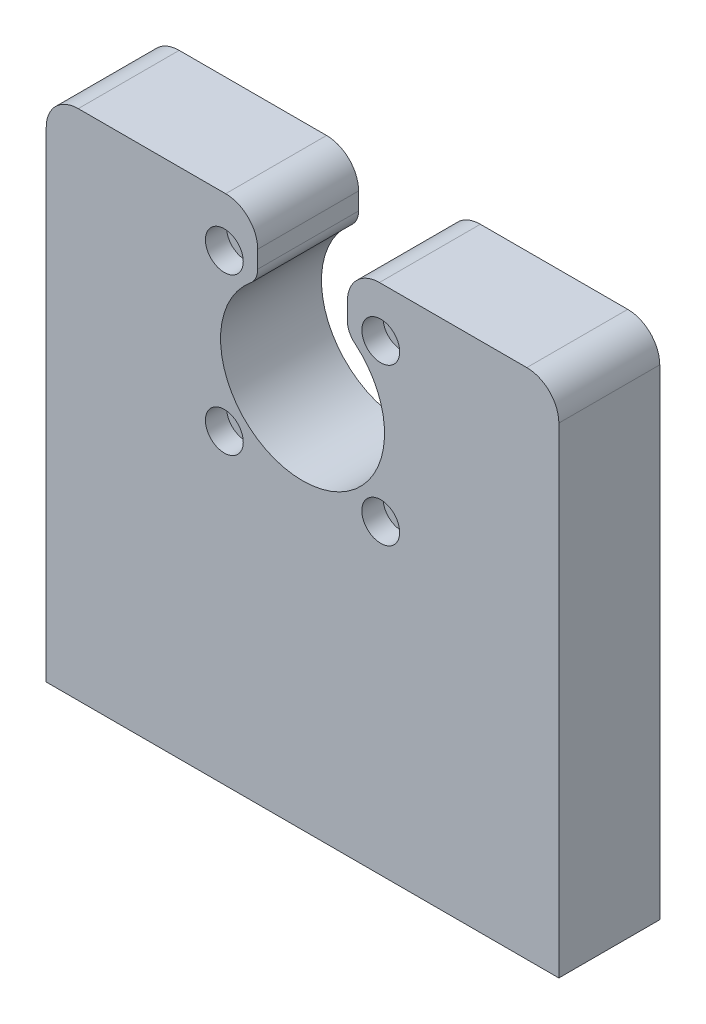
ISO-10303-21;
HEADER;
FILE_DESCRIPTION(('STEP AP214'),'2;1');
FILE_NAME('part.step','',(''),(''),'','','');
FILE_SCHEMA(('AUTOMOTIVE_DESIGN { 1 0 10303 214 1 1 1 1 }'));
ENDSEC;
DATA;
#1=APPLICATION_CONTEXT('core data for automotive mechanical design processes');
#2=APPLICATION_PROTOCOL_DEFINITION('international standard','automotive_design',2000,#1);
#3=PRODUCT_CONTEXT('',#1,'mechanical');
#4=PRODUCT('Part','Part','',(#3));
#5=PRODUCT_RELATED_PRODUCT_CATEGORY('part','',(#4));
#6=PRODUCT_DEFINITION_FORMATION('','',#4);
#7=PRODUCT_DEFINITION_CONTEXT('part definition',#1,'design');
#8=PRODUCT_DEFINITION('design','',#6,#7);
#9=PRODUCT_DEFINITION_SHAPE('','',#8);
#10=(LENGTH_UNIT() NAMED_UNIT(*) SI_UNIT(.MILLI.,.METRE.));
#11=(NAMED_UNIT(*) PLANE_ANGLE_UNIT() SI_UNIT($,.RADIAN.));
#12=(NAMED_UNIT(*) SI_UNIT($,.STERADIAN.) SOLID_ANGLE_UNIT());
#13=UNCERTAINTY_MEASURE_WITH_UNIT(LENGTH_MEASURE(1.E-05),#10,'distance_accuracy_value','');
#14=(GEOMETRIC_REPRESENTATION_CONTEXT(3) GLOBAL_UNCERTAINTY_ASSIGNED_CONTEXT((#13)) GLOBAL_UNIT_ASSIGNED_CONTEXT((#10,
#11,#12)) REPRESENTATION_CONTEXT('',''));
#15=CARTESIAN_POINT('',(0.,0.,0.));
#16=DIRECTION('',(0.,0.,1.));
#17=DIRECTION('',(1.,0.,0.));
#18=AXIS2_PLACEMENT_3D('',#15,#16,#17);
#19=CARTESIAN_POINT('',(-15.5,-15.5,-45.9619407771256));
#20=DIRECTION('',(0.,0.,1.));
#21=DIRECTION('',(1.,0.,0.));
#22=AXIS2_PLACEMENT_3D('',#19,#20,#21);
#23=CYLINDRICAL_SURFACE('',#22,2.15);
#24=CARTESIAN_POINT('',(-15.5,-15.5,0.));
#25=DIRECTION('',(0.,0.,-1.));
#26=DIRECTION('',(-1.,0.,0.));
#27=AXIS2_PLACEMENT_3D('',#24,#25,#26);
#28=CIRCLE('',#27,2.15);
#29=CARTESIAN_POINT('',(-17.65,-15.5,0.));
#30=VERTEX_POINT('',#29);
#31=EDGE_CURVE('E272',#30,#30,#28,.F.);
#32=ORIENTED_EDGE('',*,*,#31,.F.);
#33=EDGE_LOOP('',(#32));
#34=FACE_BOUND('',#33,.T.);
#35=CARTESIAN_POINT('',(-15.5,-15.5,15.8));
#36=DIRECTION('',(0.,0.,1.));
#37=DIRECTION('',(1.,0.,0.));
#38=AXIS2_PLACEMENT_3D('',#35,#36,#37);
#39=CIRCLE('',#38,2.15);
#40=CARTESIAN_POINT('',(-13.35,-15.5,15.8));
#41=VERTEX_POINT('',#40);
#42=EDGE_CURVE('E189',#41,#41,#39,.F.);
#43=ORIENTED_EDGE('',*,*,#42,.F.);
#44=EDGE_LOOP('',(#43));
#45=FACE_BOUND('',#44,.T.);
#46=ADVANCED_FACE('F44',(#34,#45),#23,.F.);
#47=CARTESIAN_POINT('',(-15.5,15.5,-45.9619407771256));
#48=DIRECTION('',(0.,0.,1.));
#49=DIRECTION('',(1.,0.,0.));
#50=AXIS2_PLACEMENT_3D('',#47,#48,#49);
#51=CYLINDRICAL_SURFACE('',#50,2.15);
#52=CARTESIAN_POINT('',(-15.5,15.5,0.));
#53=DIRECTION('',(0.,0.,-1.));
#54=DIRECTION('',(-1.,0.,0.));
#55=AXIS2_PLACEMENT_3D('',#52,#53,#54);
#56=CIRCLE('',#55,2.15);
#57=CARTESIAN_POINT('',(-17.65,15.5,0.));
#58=VERTEX_POINT('',#57);
#59=EDGE_CURVE('E288',#58,#58,#56,.F.);
#60=ORIENTED_EDGE('',*,*,#59,.F.);
#61=EDGE_LOOP('',(#60));
#62=FACE_BOUND('',#61,.T.);
#63=CARTESIAN_POINT('',(-15.5,15.5,15.8));
#64=DIRECTION('',(0.,0.,1.));
#65=DIRECTION('',(1.,0.,0.));
#66=AXIS2_PLACEMENT_3D('',#63,#64,#65);
#67=CIRCLE('',#66,2.15);
#68=CARTESIAN_POINT('',(-13.35,15.5,15.8));
#69=VERTEX_POINT('',#68);
#70=EDGE_CURVE('E186',#69,#69,#67,.F.);
#71=ORIENTED_EDGE('',*,*,#70,.F.);
#72=EDGE_LOOP('',(#71));
#73=FACE_BOUND('',#72,.T.);
#74=ADVANCED_FACE('F344',(#62,#73),#51,.F.);
#75=CARTESIAN_POINT('',(15.5,-15.5,-45.9619407771256));
#76=DIRECTION('',(0.,0.,1.));
#77=DIRECTION('',(1.,0.,0.));
#78=AXIS2_PLACEMENT_3D('',#75,#76,#77);
#79=CYLINDRICAL_SURFACE('',#78,2.15);
#80=CARTESIAN_POINT('',(15.5,-15.5,0.));
#81=DIRECTION('',(0.,0.,-1.));
#82=DIRECTION('',(-1.,0.,0.));
#83=AXIS2_PLACEMENT_3D('',#80,#81,#82);
#84=CIRCLE('',#83,2.15);
#85=CARTESIAN_POINT('',(13.35,-15.5,0.));
#86=VERTEX_POINT('',#85);
#87=EDGE_CURVE('E285',#86,#86,#84,.F.);
#88=ORIENTED_EDGE('',*,*,#87,.F.);
#89=EDGE_LOOP('',(#88));
#90=FACE_BOUND('',#89,.T.);
#91=CARTESIAN_POINT('',(15.5,-15.5,15.8));
#92=DIRECTION('',(0.,0.,1.));
#93=DIRECTION('',(1.,0.,0.));
#94=AXIS2_PLACEMENT_3D('',#91,#92,#93);
#95=CIRCLE('',#94,2.15);
#96=CARTESIAN_POINT('',(17.65,-15.5,15.8));
#97=VERTEX_POINT('',#96);
#98=EDGE_CURVE('E182',#97,#97,#95,.F.);
#99=ORIENTED_EDGE('',*,*,#98,.F.);
#100=EDGE_LOOP('',(#99));
#101=FACE_BOUND('',#100,.T.);
#102=ADVANCED_FACE('F350',(#90,#101),#79,.F.);
#103=CARTESIAN_POINT('',(15.5,15.5,-45.9619407771256));
#104=DIRECTION('',(0.,0.,1.));
#105=DIRECTION('',(1.,0.,0.));
#106=AXIS2_PLACEMENT_3D('',#103,#104,#105);
#107=CYLINDRICAL_SURFACE('',#106,2.15);
#108=CARTESIAN_POINT('',(15.5,15.5,0.));
#109=DIRECTION('',(0.,0.,-1.));
#110=DIRECTION('',(-1.,0.,0.));
#111=AXIS2_PLACEMENT_3D('',#108,#109,#110);
#112=CIRCLE('',#111,2.15);
#113=CARTESIAN_POINT('',(13.35,15.5,0.));
#114=VERTEX_POINT('',#113);
#115=EDGE_CURVE('E192',#114,#114,#112,.F.);
#116=ORIENTED_EDGE('',*,*,#115,.F.);
#117=EDGE_LOOP('',(#116));
#118=FACE_BOUND('',#117,.T.);
#119=CARTESIAN_POINT('',(15.5,15.5,15.8));
#120=DIRECTION('',(0.,0.,1.));
#121=DIRECTION('',(1.,0.,0.));
#122=AXIS2_PLACEMENT_3D('',#119,#120,#121);
#123=CIRCLE('',#122,2.15);
#124=CARTESIAN_POINT('',(17.65,15.5,15.8));
#125=VERTEX_POINT('',#124);
#126=EDGE_CURVE('E179',#125,#125,#123,.F.);
#127=ORIENTED_EDGE('',*,*,#126,.F.);
#128=EDGE_LOOP('',(#127));
#129=FACE_BOUND('',#128,.T.);
#130=ADVANCED_FACE('F358',(#118,#129),#107,.F.);
#131=CARTESIAN_POINT('',(-50.8,25.4,20.));
#132=DIRECTION('',(1.,0.,0.));
#133=DIRECTION('',(0.,1.,0.));
#134=AXIS2_PLACEMENT_3D('',#131,#132,#133);
#135=PLANE('',#134);
#136=DIRECTION('',(0.,-1.,0.));
#137=VECTOR('',#136,1.);
#138=CARTESIAN_POINT('',(-50.8,25.4,20.));
#139=LINE('',#138,#137);
#140=CARTESIAN_POINT('',(-50.8,19.05,20.));
#141=VERTEX_POINT('',#140);
#142=CARTESIAN_POINT('',(-50.8,-76.2,20.));
#143=VERTEX_POINT('',#142);
#144=EDGE_CURVE('E143',#141,#143,#139,.T.);
#145=ORIENTED_EDGE('',*,*,#144,.F.);
#146=DIRECTION('',(0.,0.,-1.));
#147=VECTOR('',#146,1.);
#148=CARTESIAN_POINT('',(-50.8,19.05,20.));
#149=LINE('',#148,#147);
#150=CARTESIAN_POINT('',(-50.8,19.05,0.));
#151=VERTEX_POINT('',#150);
#152=EDGE_CURVE('E211',#141,#151,#149,.T.);
#153=ORIENTED_EDGE('',*,*,#152,.T.);
#154=DIRECTION('',(0.,-1.,0.));
#155=VECTOR('',#154,1.);
#156=CARTESIAN_POINT('',(-50.8,25.4,0.));
#157=LINE('',#156,#155);
#158=CARTESIAN_POINT('',(-50.8,-76.2,0.));
#159=VERTEX_POINT('',#158);
#160=EDGE_CURVE('E168',#151,#159,#157,.T.);
#161=ORIENTED_EDGE('',*,*,#160,.T.);
#162=DIRECTION('',(0.,0.,-1.));
#163=VECTOR('',#162,1.);
#164=CARTESIAN_POINT('',(-50.8,-76.2,20.));
#165=LINE('',#164,#163);
#166=EDGE_CURVE('E160',#143,#159,#165,.T.);
#167=ORIENTED_EDGE('',*,*,#166,.F.);
#168=EDGE_LOOP('',(#145,#153,#161,#167));
#169=FACE_BOUND('',#168,.T.);
#170=ADVANCED_FACE('F166',(#169),#135,.F.);
#171=CARTESIAN_POINT('',(50.8,-76.2,20.));
#172=DIRECTION('',(0.,1.,0.));
#173=DIRECTION('',(-1.,0.,0.));
#174=AXIS2_PLACEMENT_3D('',#171,#172,#173);
#175=PLANE('',#174);
#176=DIRECTION('',(1.,0.,0.));
#177=VECTOR('',#176,1.);
#178=CARTESIAN_POINT('',(50.8,-76.2,0.));
#179=LINE('',#178,#177);
#180=CARTESIAN_POINT('',(50.8,-76.2,0.));
#181=VERTEX_POINT('',#180);
#182=EDGE_CURVE('E255',#159,#181,#179,.T.);
#183=ORIENTED_EDGE('',*,*,#182,.T.);
#184=DIRECTION('',(0.,0.,-1.));
#185=VECTOR('',#184,1.);
#186=CARTESIAN_POINT('',(50.8,-76.2,20.));
#187=LINE('',#186,#185);
#188=CARTESIAN_POINT('',(50.8,-76.2,20.));
#189=VERTEX_POINT('',#188);
#190=EDGE_CURVE('E162',#189,#181,#187,.T.);
#191=ORIENTED_EDGE('',*,*,#190,.F.);
#192=DIRECTION('',(1.,0.,0.));
#193=VECTOR('',#192,1.);
#194=CARTESIAN_POINT('',(50.8,-76.2,20.));
#195=LINE('',#194,#193);
#196=EDGE_CURVE('E147',#143,#189,#195,.T.);
#197=ORIENTED_EDGE('',*,*,#196,.F.);
#198=ORIENTED_EDGE('',*,*,#166,.T.);
#199=EDGE_LOOP('',(#183,#191,#197,#198));
#200=FACE_BOUND('',#199,.T.);
#201=ADVANCED_FACE('F159',(#200),#175,.F.);
#202=CARTESIAN_POINT('',(50.8,25.4,20.));
#203=DIRECTION('',(-1.,0.,0.));
#204=DIRECTION('',(0.,-1.,0.));
#205=AXIS2_PLACEMENT_3D('',#202,#203,#204);
#206=PLANE('',#205);
#207=DIRECTION('',(0.,1.,0.));
#208=VECTOR('',#207,1.);
#209=CARTESIAN_POINT('',(50.8,25.4,0.));
#210=LINE('',#209,#208);
#211=CARTESIAN_POINT('',(50.8,19.05,0.));
#212=VERTEX_POINT('',#211);
#213=EDGE_CURVE('E251',#181,#212,#210,.T.);
#214=ORIENTED_EDGE('',*,*,#213,.T.);
#215=DIRECTION('',(0.,0.,-1.));
#216=VECTOR('',#215,1.);
#217=CARTESIAN_POINT('',(50.8,19.05,20.));
#218=LINE('',#217,#216);
#219=CARTESIAN_POINT('',(50.8,19.05,20.));
#220=VERTEX_POINT('',#219);
#221=EDGE_CURVE('E11',#212,#220,#218,.F.);
#222=ORIENTED_EDGE('',*,*,#221,.T.);
#223=DIRECTION('',(0.,1.,0.));
#224=VECTOR('',#223,1.);
#225=CARTESIAN_POINT('',(50.8,25.4,20.));
#226=LINE('',#225,#224);
#227=EDGE_CURVE('E164',#189,#220,#226,.T.);
#228=ORIENTED_EDGE('',*,*,#227,.F.);
#229=ORIENTED_EDGE('',*,*,#190,.T.);
#230=EDGE_LOOP('',(#214,#222,#228,#229));
#231=FACE_BOUND('',#230,.T.);
#232=ADVANCED_FACE('F383',(#231),#206,.F.);
#233=CARTESIAN_POINT('',(50.8,25.4,20.));
#234=DIRECTION('',(0.,-1.,0.));
#235=DIRECTION('',(1.,0.,0.));
#236=AXIS2_PLACEMENT_3D('',#233,#234,#235);
#237=PLANE('',#236);
#238=DIRECTION('',(-1.,0.,0.));
#239=VECTOR('',#238,1.);
#240=CARTESIAN_POINT('',(50.8,25.4,0.));
#241=LINE('',#240,#239);
#242=CARTESIAN_POINT('',(44.45,25.4,0.));
#243=VERTEX_POINT('',#242);
#244=CARTESIAN_POINT('',(15.24,25.4,0.));
#245=VERTEX_POINT('',#244);
#246=EDGE_CURVE('E242',#243,#245,#241,.T.);
#247=ORIENTED_EDGE('',*,*,#246,.T.);
#248=DIRECTION('',(0.,0.,-1.));
#249=VECTOR('',#248,1.);
#250=CARTESIAN_POINT('',(15.24,25.4,20.));
#251=LINE('',#250,#249);
#252=CARTESIAN_POINT('',(15.24,25.4,20.));
#253=VERTEX_POINT('',#252);
#254=EDGE_CURVE('E52',#245,#253,#251,.F.);
#255=ORIENTED_EDGE('',*,*,#254,.T.);
#256=DIRECTION('',(-1.,0.,0.));
#257=VECTOR('',#256,1.);
#258=CARTESIAN_POINT('',(50.8,25.4,20.));
#259=LINE('',#258,#257);
#260=CARTESIAN_POINT('',(44.45,25.4,20.));
#261=VERTEX_POINT('',#260);
#262=EDGE_CURVE('E243',#261,#253,#259,.T.);
#263=ORIENTED_EDGE('',*,*,#262,.F.);
#264=DIRECTION('',(0.,0.,-1.));
#265=VECTOR('',#264,1.);
#266=CARTESIAN_POINT('',(44.45,25.4,20.));
#267=LINE('',#266,#265);
#268=EDGE_CURVE('E237',#261,#243,#267,.T.);
#269=ORIENTED_EDGE('',*,*,#268,.T.);
#270=EDGE_LOOP('',(#247,#255,#263,#269));
#271=FACE_BOUND('',#270,.T.);
#272=ADVANCED_FACE('F241',(#271),#237,.F.);
#273=CARTESIAN_POINT('',(8.89000000000001,25.4,20.));
#274=DIRECTION('',(1.,0.,0.));
#275=DIRECTION('',(0.,1.,0.));
#276=AXIS2_PLACEMENT_3D('',#273,#274,#275);
#277=PLANE('',#276);
#278=DIRECTION('',(0.,-1.,0.));
#279=VECTOR('',#278,1.);
#280=CARTESIAN_POINT('',(8.89000000000001,25.4,20.));
#281=LINE('',#280,#279);
#282=CARTESIAN_POINT('',(8.89000000000001,19.05,20.));
#283=VERTEX_POINT('',#282);
#284=CARTESIAN_POINT('',(8.89000000000001,15.6176310623603,20.));
#285=VERTEX_POINT('',#284);
#286=EDGE_CURVE('E279',#283,#285,#281,.T.);
#287=ORIENTED_EDGE('',*,*,#286,.F.);
#288=DIRECTION('',(0.,0.,-1.));
#289=VECTOR('',#288,1.);
#290=CARTESIAN_POINT('',(8.89000000000001,19.05,20.));
#291=LINE('',#290,#289);
#292=CARTESIAN_POINT('',(8.89000000000001,19.05,0.));
#293=VERTEX_POINT('',#292);
#294=EDGE_CURVE('E234',#283,#293,#291,.T.);
#295=ORIENTED_EDGE('',*,*,#294,.T.);
#296=DIRECTION('',(0.,-1.,0.));
#297=VECTOR('',#296,1.);
#298=CARTESIAN_POINT('',(8.89000000000001,25.4,0.));
#299=LINE('',#298,#297);
#300=CARTESIAN_POINT('',(8.89000000000001,15.6176310623603,0.));
#301=VERTEX_POINT('',#300);
#302=EDGE_CURVE('E250',#293,#301,#299,.T.);
#303=ORIENTED_EDGE('',*,*,#302,.T.);
#304=DIRECTION('',(0.,0.,1.));
#305=VECTOR('',#304,1.);
#306=CARTESIAN_POINT('',(8.89000000000001,15.6176310623603,20.));
#307=LINE('',#306,#305);
#308=EDGE_CURVE('E173',#301,#285,#307,.T.);
#309=ORIENTED_EDGE('',*,*,#308,.T.);
#310=EDGE_LOOP('',(#287,#295,#303,#309));
#311=FACE_BOUND('',#310,.T.);
#312=ADVANCED_FACE('F376',(#311),#277,.F.);
#313=CARTESIAN_POINT('',(-8.88999999999999,25.4,20.));
#314=DIRECTION('',(-1.,0.,0.));
#315=DIRECTION('',(0.,-1.,0.));
#316=AXIS2_PLACEMENT_3D('',#313,#314,#315);
#317=PLANE('',#316);
#318=DIRECTION('',(0.,1.,0.));
#319=VECTOR('',#318,1.);
#320=CARTESIAN_POINT('',(-8.88999999999999,25.4,0.));
#321=LINE('',#320,#319);
#322=CARTESIAN_POINT('',(-8.88999999999999,15.6176310623603,0.));
#323=VERTEX_POINT('',#322);
#324=CARTESIAN_POINT('',(-8.88999999999999,19.05,0.));
#325=VERTEX_POINT('',#324);
#326=EDGE_CURVE('E253',#323,#325,#321,.T.);
#327=ORIENTED_EDGE('',*,*,#326,.T.);
#328=DIRECTION('',(0.,0.,-1.));
#329=VECTOR('',#328,1.);
#330=CARTESIAN_POINT('',(-8.88999999999999,19.05,20.));
#331=LINE('',#330,#329);
#332=CARTESIAN_POINT('',(-8.88999999999999,19.05,20.));
#333=VERTEX_POINT('',#332);
#334=EDGE_CURVE('E232',#325,#333,#331,.F.);
#335=ORIENTED_EDGE('',*,*,#334,.T.);
#336=DIRECTION('',(0.,1.,0.));
#337=VECTOR('',#336,1.);
#338=CARTESIAN_POINT('',(-8.88999999999999,25.4,20.));
#339=LINE('',#338,#337);
#340=CARTESIAN_POINT('',(-8.88999999999999,15.6176310623603,20.));
#341=VERTEX_POINT('',#340);
#342=EDGE_CURVE('E276',#341,#333,#339,.T.);
#343=ORIENTED_EDGE('',*,*,#342,.F.);
#344=DIRECTION('',(0.,0.,1.));
#345=VECTOR('',#344,1.);
#346=CARTESIAN_POINT('',(-8.88999999999999,15.6176310623603,20.));
#347=LINE('',#346,#345);
#348=EDGE_CURVE('E208',#341,#323,#347,.F.);
#349=ORIENTED_EDGE('',*,*,#348,.T.);
#350=EDGE_LOOP('',(#327,#335,#343,#349));
#351=FACE_BOUND('',#350,.T.);
#352=ADVANCED_FACE('F373',(#351),#317,.F.);
#353=CARTESIAN_POINT('',(-8.88999999999999,25.4,20.));
#354=DIRECTION('',(0.,-1.,0.));
#355=DIRECTION('',(1.,0.,0.));
#356=AXIS2_PLACEMENT_3D('',#353,#354,#355);
#357=PLANE('',#356);
#358=DIRECTION('',(-1.,0.,0.));
#359=VECTOR('',#358,1.);
#360=CARTESIAN_POINT('',(-8.88999999999999,25.4,0.));
#361=LINE('',#360,#359);
#362=CARTESIAN_POINT('',(-15.24,25.4,0.));
#363=VERTEX_POINT('',#362);
#364=CARTESIAN_POINT('',(-44.45,25.4,0.));
#365=VERTEX_POINT('',#364);
#366=EDGE_CURVE('E155',#363,#365,#361,.T.);
#367=ORIENTED_EDGE('',*,*,#366,.T.);
#368=DIRECTION('',(0.,0.,-1.));
#369=VECTOR('',#368,1.);
#370=CARTESIAN_POINT('',(-44.45,25.4,20.));
#371=LINE('',#370,#369);
#372=CARTESIAN_POINT('',(-44.45,25.4,20.));
#373=VERTEX_POINT('',#372);
#374=EDGE_CURVE('E224',#365,#373,#371,.F.);
#375=ORIENTED_EDGE('',*,*,#374,.T.);
#376=DIRECTION('',(-1.,0.,0.));
#377=VECTOR('',#376,1.);
#378=CARTESIAN_POINT('',(-8.88999999999999,25.4,20.));
#379=LINE('',#378,#377);
#380=CARTESIAN_POINT('',(-15.24,25.4,20.));
#381=VERTEX_POINT('',#380);
#382=EDGE_CURVE('E175',#381,#373,#379,.T.);
#383=ORIENTED_EDGE('',*,*,#382,.F.);
#384=DIRECTION('',(0.,0.,-1.));
#385=VECTOR('',#384,1.);
#386=CARTESIAN_POINT('',(-15.24,25.4,20.));
#387=LINE('',#386,#385);
#388=EDGE_CURVE('E221',#381,#363,#387,.T.);
#389=ORIENTED_EDGE('',*,*,#388,.T.);
#390=EDGE_LOOP('',(#367,#375,#383,#389));
#391=FACE_BOUND('',#390,.T.);
#392=ADVANCED_FACE('F264',(#391),#357,.F.);
#393=CARTESIAN_POINT('',(0.,0.,20.));
#394=DIRECTION('',(0.,0.,-1.));
#395=DIRECTION('',(-1.,0.,0.));
#396=AXIS2_PLACEMENT_3D('',#393,#394,#395);
#397=PLANE('',#396);
#398=CARTESIAN_POINT('',(-15.5,-15.5,20.));
#399=DIRECTION('',(0.,0.,1.));
#400=DIRECTION('',(1.,0.,0.));
#401=AXIS2_PLACEMENT_3D('',#398,#399,#400);
#402=CIRCLE('',#401,3.75);
#403=CARTESIAN_POINT('',(-11.75,-15.5,20.));
#404=VERTEX_POINT('',#403);
#405=EDGE_CURVE('E302',#404,#404,#402,.T.);
#406=ORIENTED_EDGE('',*,*,#405,.F.);
#407=EDGE_LOOP('',(#406));
#408=FACE_BOUND('',#407,.T.);
#409=CARTESIAN_POINT('',(15.5,-15.5,20.));
#410=DIRECTION('',(0.,0.,1.));
#411=DIRECTION('',(1.,0.,0.));
#412=AXIS2_PLACEMENT_3D('',#409,#410,#411);
#413=CIRCLE('',#412,3.75);
#414=CARTESIAN_POINT('',(19.25,-15.5,20.));
#415=VERTEX_POINT('',#414);
#416=EDGE_CURVE('E308',#415,#415,#413,.T.);
#417=ORIENTED_EDGE('',*,*,#416,.F.);
#418=EDGE_LOOP('',(#417));
#419=FACE_BOUND('',#418,.T.);
#420=CARTESIAN_POINT('',(15.5,15.5,20.));
#421=DIRECTION('',(0.,0.,1.));
#422=DIRECTION('',(1.,0.,0.));
#423=AXIS2_PLACEMENT_3D('',#420,#421,#422);
#424=CIRCLE('',#423,3.75);
#425=CARTESIAN_POINT('',(19.25,15.5,20.));
#426=VERTEX_POINT('',#425);
#427=EDGE_CURVE('E296',#426,#426,#424,.T.);
#428=ORIENTED_EDGE('',*,*,#427,.F.);
#429=EDGE_LOOP('',(#428));
#430=FACE_BOUND('',#429,.T.);
#431=CARTESIAN_POINT('',(-15.5,15.5,20.));
#432=DIRECTION('',(0.,0.,1.));
#433=DIRECTION('',(1.,0.,0.));
#434=AXIS2_PLACEMENT_3D('',#431,#432,#433);
#435=CIRCLE('',#434,3.75);
#436=CARTESIAN_POINT('',(-11.75,15.5,20.));
#437=VERTEX_POINT('',#436);
#438=EDGE_CURVE('E293',#437,#437,#435,.T.);
#439=ORIENTED_EDGE('',*,*,#438,.F.);
#440=EDGE_LOOP('',(#439));
#441=FACE_BOUND('',#440,.T.);
#442=ORIENTED_EDGE('',*,*,#382,.T.);
#443=CARTESIAN_POINT('',(-44.45,19.05,20.));
#444=DIRECTION('',(0.,0.,-1.));
#445=DIRECTION('',(-1.,0.,0.));
#446=AXIS2_PLACEMENT_3D('',#443,#444,#445);
#447=CIRCLE('',#446,6.35);
#448=EDGE_CURVE('E150',#373,#141,#447,.F.);
#449=ORIENTED_EDGE('',*,*,#448,.T.);
#450=ORIENTED_EDGE('',*,*,#144,.T.);
#451=ORIENTED_EDGE('',*,*,#196,.T.);
#452=ORIENTED_EDGE('',*,*,#227,.T.);
#453=CARTESIAN_POINT('',(44.45,19.05,20.));
#454=DIRECTION('',(0.,0.,-1.));
#455=DIRECTION('',(-1.,0.,0.));
#456=AXIS2_PLACEMENT_3D('',#453,#454,#455);
#457=CIRCLE('',#456,6.35);
#458=EDGE_CURVE('E65',#220,#261,#457,.F.);
#459=ORIENTED_EDGE('',*,*,#458,.T.);
#460=ORIENTED_EDGE('',*,*,#262,.T.);
#461=CARTESIAN_POINT('',(15.24,19.05,20.));
#462=DIRECTION('',(0.,0.,-1.));
#463=DIRECTION('',(-1.,0.,0.));
#464=AXIS2_PLACEMENT_3D('',#461,#462,#463);
#465=CIRCLE('',#464,6.35);
#466=EDGE_CURVE('E227',#253,#283,#465,.F.);
#467=ORIENTED_EDGE('',*,*,#466,.T.);
#468=ORIENTED_EDGE('',*,*,#286,.T.);
#469=CARTESIAN_POINT('',(12.89,15.6176310623603,20.));
#470=DIRECTION('',(0.,0.,-1.));
#471=DIRECTION('',(-1.,0.,0.));
#472=AXIS2_PLACEMENT_3D('',#469,#470,#471);
#473=CIRCLE('',#472,4.);
#474=CARTESIAN_POINT('',(10.3438271604938,12.532666901894,20.));
#475=VERTEX_POINT('',#474);
#476=EDGE_CURVE('E197',#285,#475,#473,.F.);
#477=ORIENTED_EDGE('',*,*,#476,.T.);
#478=CARTESIAN_POINT('',(0.,0.,20.));
#479=DIRECTION('',(0.,0.,1.));
#480=DIRECTION('',(1.,0.,0.));
#481=AXIS2_PLACEMENT_3D('',#478,#479,#480);
#482=CIRCLE('',#481,16.25);
#483=CARTESIAN_POINT('',(-10.3438271604938,12.5326669018941,20.));
#484=VERTEX_POINT('',#483);
#485=EDGE_CURVE('E269',#484,#475,#482,.T.);
#486=ORIENTED_EDGE('',*,*,#485,.F.);
#487=CARTESIAN_POINT('',(-12.89,15.6176310623603,20.));
#488=DIRECTION('',(0.,0.,-1.));
#489=DIRECTION('',(-1.,0.,0.));
#490=AXIS2_PLACEMENT_3D('',#487,#488,#489);
#491=CIRCLE('',#490,4.);
#492=EDGE_CURVE('E195',#484,#341,#491,.F.);
#493=ORIENTED_EDGE('',*,*,#492,.T.);
#494=ORIENTED_EDGE('',*,*,#342,.T.);
#495=CARTESIAN_POINT('',(-15.24,19.05,20.));
#496=DIRECTION('',(0.,0.,-1.));
#497=DIRECTION('',(-1.,0.,0.));
#498=AXIS2_PLACEMENT_3D('',#495,#496,#497);
#499=CIRCLE('',#498,6.35);
#500=EDGE_CURVE('E229',#333,#381,#499,.F.);
#501=ORIENTED_EDGE('',*,*,#500,.T.);
#502=EDGE_LOOP('',(#442,#449,#450,#451,#452,#459,#460,#467,#468,#477,#486,#493,#494,#501));
#503=FACE_BOUND('',#502,.T.);
#504=ADVANCED_FACE('F146',(#408,#419,#430,#441,#503),#397,.F.);
#505=CARTESIAN_POINT('',(0.,0.,0.));
#506=DIRECTION('',(0.,0.,-1.));
#507=DIRECTION('',(-1.,0.,0.));
#508=AXIS2_PLACEMENT_3D('',#505,#506,#507);
#509=PLANE('',#508);
#510=ORIENTED_EDGE('',*,*,#115,.T.);
#511=EDGE_LOOP('',(#510));
#512=FACE_BOUND('',#511,.T.);
#513=ORIENTED_EDGE('',*,*,#87,.T.);
#514=EDGE_LOOP('',(#513));
#515=FACE_BOUND('',#514,.T.);
#516=ORIENTED_EDGE('',*,*,#59,.T.);
#517=EDGE_LOOP('',(#516));
#518=FACE_BOUND('',#517,.T.);
#519=ORIENTED_EDGE('',*,*,#31,.T.);
#520=EDGE_LOOP('',(#519));
#521=FACE_BOUND('',#520,.T.);
#522=ORIENTED_EDGE('',*,*,#160,.F.);
#523=CARTESIAN_POINT('',(-44.45,19.05,0.));
#524=DIRECTION('',(0.,0.,-1.));
#525=DIRECTION('',(-1.,0.,0.));
#526=AXIS2_PLACEMENT_3D('',#523,#524,#525);
#527=CIRCLE('',#526,6.35);
#528=EDGE_CURVE('E219',#151,#365,#527,.T.);
#529=ORIENTED_EDGE('',*,*,#528,.T.);
#530=ORIENTED_EDGE('',*,*,#366,.F.);
#531=CARTESIAN_POINT('',(-15.24,19.05,0.));
#532=DIRECTION('',(0.,0.,-1.));
#533=DIRECTION('',(-1.,0.,0.));
#534=AXIS2_PLACEMENT_3D('',#531,#532,#533);
#535=CIRCLE('',#534,6.35);
#536=EDGE_CURVE('E217',#363,#325,#535,.T.);
#537=ORIENTED_EDGE('',*,*,#536,.T.);
#538=ORIENTED_EDGE('',*,*,#326,.F.);
#539=CARTESIAN_POINT('',(-12.89,15.6176310623603,0.));
#540=DIRECTION('',(0.,0.,-1.));
#541=DIRECTION('',(-1.,0.,0.));
#542=AXIS2_PLACEMENT_3D('',#539,#540,#541);
#543=CIRCLE('',#542,4.);
#544=CARTESIAN_POINT('',(-10.3438271604938,12.5326669018941,0.));
#545=VERTEX_POINT('',#544);
#546=EDGE_CURVE('E203',#323,#545,#543,.T.);
#547=ORIENTED_EDGE('',*,*,#546,.T.);
#548=CARTESIAN_POINT('',(0.,0.,0.));
#549=DIRECTION('',(0.,0.,-1.));
#550=DIRECTION('',(-1.,0.,0.));
#551=AXIS2_PLACEMENT_3D('',#548,#549,#550);
#552=CIRCLE('',#551,16.25);
#553=CARTESIAN_POINT('',(10.3438271604938,12.532666901894,0.));
#554=VERTEX_POINT('',#553);
#555=EDGE_CURVE('E170',#554,#545,#552,.T.);
#556=ORIENTED_EDGE('',*,*,#555,.F.);
#557=CARTESIAN_POINT('',(12.89,15.6176310623603,0.));
#558=DIRECTION('',(0.,0.,-1.));
#559=DIRECTION('',(-1.,0.,0.));
#560=AXIS2_PLACEMENT_3D('',#557,#558,#559);
#561=CIRCLE('',#560,4.);
#562=EDGE_CURVE('E205',#554,#301,#561,.T.);
#563=ORIENTED_EDGE('',*,*,#562,.T.);
#564=ORIENTED_EDGE('',*,*,#302,.F.);
#565=CARTESIAN_POINT('',(15.24,19.05,0.));
#566=DIRECTION('',(0.,0.,-1.));
#567=DIRECTION('',(-1.,0.,0.));
#568=AXIS2_PLACEMENT_3D('',#565,#566,#567);
#569=CIRCLE('',#568,6.35);
#570=EDGE_CURVE('E215',#293,#245,#569,.T.);
#571=ORIENTED_EDGE('',*,*,#570,.T.);
#572=ORIENTED_EDGE('',*,*,#246,.F.);
#573=CARTESIAN_POINT('',(44.45,19.05,0.));
#574=DIRECTION('',(0.,0.,-1.));
#575=DIRECTION('',(-1.,0.,0.));
#576=AXIS2_PLACEMENT_3D('',#573,#574,#575);
#577=CIRCLE('',#576,6.35);
#578=EDGE_CURVE('E213',#243,#212,#577,.T.);
#579=ORIENTED_EDGE('',*,*,#578,.T.);
#580=ORIENTED_EDGE('',*,*,#213,.F.);
#581=ORIENTED_EDGE('',*,*,#182,.F.);
#582=EDGE_LOOP('',(#522,#529,#530,#537,#538,#547,#556,#563,#564,#571,#572,#579,#580,#581));
#583=FACE_BOUND('',#582,.T.);
#584=ADVANCED_FACE('F246',(#512,#515,#518,#521,#583),#509,.T.);
#585=CARTESIAN_POINT('',(0.,0.,-45.9619407771256));
#586=DIRECTION('',(0.,0.,1.));
#587=DIRECTION('',(1.,0.,0.));
#588=AXIS2_PLACEMENT_3D('',#585,#586,#587);
#589=CYLINDRICAL_SURFACE('',#588,16.25);
#590=ORIENTED_EDGE('',*,*,#485,.T.);
#591=DIRECTION('',(0.,0.,1.));
#592=VECTOR('',#591,1.);
#593=CARTESIAN_POINT('',(10.3438271604938,12.532666901894,-45.9619407771256));
#594=LINE('',#593,#592);
#595=EDGE_CURVE('E201',#475,#554,#594,.F.);
#596=ORIENTED_EDGE('',*,*,#595,.T.);
#597=ORIENTED_EDGE('',*,*,#555,.T.);
#598=DIRECTION('',(0.,0.,1.));
#599=VECTOR('',#598,1.);
#600=CARTESIAN_POINT('',(-10.3438271604938,12.5326669018941,-45.9619407771256));
#601=LINE('',#600,#599);
#602=EDGE_CURVE('E199',#545,#484,#601,.T.);
#603=ORIENTED_EDGE('',*,*,#602,.T.);
#604=EDGE_LOOP('',(#590,#596,#597,#603));
#605=FACE_BOUND('',#604,.T.);
#606=ADVANCED_FACE('F363',(#605),#589,.F.);
#607=CARTESIAN_POINT('',(15.5,15.5,15.8));
#608=DIRECTION('',(0.,0.,1.));
#609=DIRECTION('',(1.,0.,0.));
#610=AXIS2_PLACEMENT_3D('',#607,#608,#609);
#611=PLANE('',#610);
#612=CARTESIAN_POINT('',(15.5,15.5,15.8));
#613=DIRECTION('',(0.,0.,1.));
#614=DIRECTION('',(1.,0.,0.));
#615=AXIS2_PLACEMENT_3D('',#612,#613,#614);
#616=CIRCLE('',#615,3.75);
#617=CARTESIAN_POINT('',(19.25,15.5,15.8));
#618=VERTEX_POINT('',#617);
#619=EDGE_CURVE('E311',#618,#618,#616,.T.);
#620=ORIENTED_EDGE('',*,*,#619,.T.);
#621=EDGE_LOOP('',(#620));
#622=FACE_BOUND('',#621,.T.);
#623=ORIENTED_EDGE('',*,*,#126,.T.);
#624=EDGE_LOOP('',(#623));
#625=FACE_BOUND('',#624,.T.);
#626=ADVANCED_FACE('F365',(#622,#625),#611,.T.);
#627=CARTESIAN_POINT('',(15.5,15.5,15.8));
#628=DIRECTION('',(0.,0.,1.));
#629=DIRECTION('',(1.,0.,0.));
#630=AXIS2_PLACEMENT_3D('',#627,#628,#629);
#631=CYLINDRICAL_SURFACE('',#630,3.75);
#632=ORIENTED_EDGE('',*,*,#619,.F.);
#633=EDGE_LOOP('',(#632));
#634=FACE_BOUND('',#633,.T.);
#635=ORIENTED_EDGE('',*,*,#427,.T.);
#636=EDGE_LOOP('',(#635));
#637=FACE_BOUND('',#636,.T.);
#638=ADVANCED_FACE('F317',(#634,#637),#631,.F.);
#639=CARTESIAN_POINT('',(15.5,-15.5,15.8));
#640=DIRECTION('',(0.,0.,1.));
#641=DIRECTION('',(1.,0.,0.));
#642=AXIS2_PLACEMENT_3D('',#639,#640,#641);
#643=PLANE('',#642);
#644=CARTESIAN_POINT('',(15.5,-15.5,15.8));
#645=DIRECTION('',(0.,0.,1.));
#646=DIRECTION('',(1.,0.,0.));
#647=AXIS2_PLACEMENT_3D('',#644,#645,#646);
#648=CIRCLE('',#647,3.75);
#649=CARTESIAN_POINT('',(19.25,-15.5,15.8));
#650=VERTEX_POINT('',#649);
#651=EDGE_CURVE('E305',#650,#650,#648,.T.);
#652=ORIENTED_EDGE('',*,*,#651,.T.);
#653=EDGE_LOOP('',(#652));
#654=FACE_BOUND('',#653,.T.);
#655=ORIENTED_EDGE('',*,*,#98,.T.);
#656=EDGE_LOOP('',(#655));
#657=FACE_BOUND('',#656,.T.);
#658=ADVANCED_FACE('F491',(#654,#657),#643,.T.);
#659=CARTESIAN_POINT('',(15.5,-15.5,15.8));
#660=DIRECTION('',(0.,0.,1.));
#661=DIRECTION('',(1.,0.,0.));
#662=AXIS2_PLACEMENT_3D('',#659,#660,#661);
#663=CYLINDRICAL_SURFACE('',#662,3.75);
#664=ORIENTED_EDGE('',*,*,#651,.F.);
#665=EDGE_LOOP('',(#664));
#666=FACE_BOUND('',#665,.T.);
#667=ORIENTED_EDGE('',*,*,#416,.T.);
#668=EDGE_LOOP('',(#667));
#669=FACE_BOUND('',#668,.T.);
#670=ADVANCED_FACE('F338',(#666,#669),#663,.F.);
#671=CARTESIAN_POINT('',(-15.5,15.5,15.8));
#672=DIRECTION('',(0.,0.,1.));
#673=DIRECTION('',(1.,0.,0.));
#674=AXIS2_PLACEMENT_3D('',#671,#672,#673);
#675=PLANE('',#674);
#676=CARTESIAN_POINT('',(-15.5,15.5,15.8));
#677=DIRECTION('',(0.,0.,1.));
#678=DIRECTION('',(1.,0.,0.));
#679=AXIS2_PLACEMENT_3D('',#676,#677,#678);
#680=CIRCLE('',#679,3.75);
#681=CARTESIAN_POINT('',(-11.75,15.5,15.8));
#682=VERTEX_POINT('',#681);
#683=EDGE_CURVE('E183',#682,#682,#680,.T.);
#684=ORIENTED_EDGE('',*,*,#683,.T.);
#685=EDGE_LOOP('',(#684));
#686=FACE_BOUND('',#685,.T.);
#687=ORIENTED_EDGE('',*,*,#70,.T.);
#688=EDGE_LOOP('',(#687));
#689=FACE_BOUND('',#688,.T.);
#690=ADVANCED_FACE('F328',(#686,#689),#675,.T.);
#691=CARTESIAN_POINT('',(-15.5,15.5,15.8));
#692=DIRECTION('',(0.,0.,1.));
#693=DIRECTION('',(1.,0.,0.));
#694=AXIS2_PLACEMENT_3D('',#691,#692,#693);
#695=CYLINDRICAL_SURFACE('',#694,3.75);
#696=ORIENTED_EDGE('',*,*,#683,.F.);
#697=EDGE_LOOP('',(#696));
#698=FACE_BOUND('',#697,.T.);
#699=ORIENTED_EDGE('',*,*,#438,.T.);
#700=EDGE_LOOP('',(#699));
#701=FACE_BOUND('',#700,.T.);
#702=ADVANCED_FACE('F325',(#698,#701),#695,.F.);
#703=CARTESIAN_POINT('',(-15.5,-15.5,15.8));
#704=DIRECTION('',(0.,0.,1.));
#705=DIRECTION('',(1.,0.,0.));
#706=AXIS2_PLACEMENT_3D('',#703,#704,#705);
#707=PLANE('',#706);
#708=CARTESIAN_POINT('',(-15.5,-15.5,15.8));
#709=DIRECTION('',(0.,0.,1.));
#710=DIRECTION('',(1.,0.,0.));
#711=AXIS2_PLACEMENT_3D('',#708,#709,#710);
#712=CIRCLE('',#711,3.75);
#713=CARTESIAN_POINT('',(-11.75,-15.5,15.8));
#714=VERTEX_POINT('',#713);
#715=EDGE_CURVE('E299',#714,#714,#712,.T.);
#716=ORIENTED_EDGE('',*,*,#715,.T.);
#717=EDGE_LOOP('',(#716));
#718=FACE_BOUND('',#717,.T.);
#719=ORIENTED_EDGE('',*,*,#42,.T.);
#720=EDGE_LOOP('',(#719));
#721=FACE_BOUND('',#720,.T.);
#722=ADVANCED_FACE('F327',(#718,#721),#707,.T.);
#723=CARTESIAN_POINT('',(-15.5,-15.5,15.8));
#724=DIRECTION('',(0.,0.,1.));
#725=DIRECTION('',(1.,0.,0.));
#726=AXIS2_PLACEMENT_3D('',#723,#724,#725);
#727=CYLINDRICAL_SURFACE('',#726,3.75);
#728=ORIENTED_EDGE('',*,*,#715,.F.);
#729=EDGE_LOOP('',(#728));
#730=FACE_BOUND('',#729,.T.);
#731=ORIENTED_EDGE('',*,*,#405,.T.);
#732=EDGE_LOOP('',(#731));
#733=FACE_BOUND('',#732,.T.);
#734=ADVANCED_FACE('F335',(#730,#733),#727,.F.);
#735=CARTESIAN_POINT('',(12.89,15.6176310623603,-45.9619407771256));
#736=DIRECTION('',(0.,0.,1.));
#737=DIRECTION('',(1.,0.,0.));
#738=AXIS2_PLACEMENT_3D('',#735,#736,#737);
#739=CYLINDRICAL_SURFACE('',#738,4.);
#740=ORIENTED_EDGE('',*,*,#562,.F.);
#741=ORIENTED_EDGE('',*,*,#595,.F.);
#742=ORIENTED_EDGE('',*,*,#476,.F.);
#743=ORIENTED_EDGE('',*,*,#308,.F.);
#744=EDGE_LOOP('',(#740,#741,#742,#743));
#745=FACE_BOUND('',#744,.T.);
#746=ADVANCED_FACE('F390',(#745),#739,.T.);
#747=CARTESIAN_POINT('',(-12.89,15.6176310623603,-45.9619407771256));
#748=DIRECTION('',(0.,0.,1.));
#749=DIRECTION('',(1.,0.,0.));
#750=AXIS2_PLACEMENT_3D('',#747,#748,#749);
#751=CYLINDRICAL_SURFACE('',#750,4.);
#752=ORIENTED_EDGE('',*,*,#492,.F.);
#753=ORIENTED_EDGE('',*,*,#602,.F.);
#754=ORIENTED_EDGE('',*,*,#546,.F.);
#755=ORIENTED_EDGE('',*,*,#348,.F.);
#756=EDGE_LOOP('',(#752,#753,#754,#755));
#757=FACE_BOUND('',#756,.T.);
#758=ADVANCED_FACE('F393',(#757),#751,.T.);
#759=CARTESIAN_POINT('',(-44.45,19.05,20.));
#760=DIRECTION('',(0.,0.,-1.));
#761=DIRECTION('',(-1.,0.,0.));
#762=AXIS2_PLACEMENT_3D('',#759,#760,#761);
#763=CYLINDRICAL_SURFACE('',#762,6.35);
#764=ORIENTED_EDGE('',*,*,#448,.F.);
#765=ORIENTED_EDGE('',*,*,#374,.F.);
#766=ORIENTED_EDGE('',*,*,#528,.F.);
#767=ORIENTED_EDGE('',*,*,#152,.F.);
#768=EDGE_LOOP('',(#764,#765,#766,#767));
#769=FACE_BOUND('',#768,.T.);
#770=ADVANCED_FACE('F268',(#769),#763,.T.);
#771=CARTESIAN_POINT('',(-15.24,19.05,20.));
#772=DIRECTION('',(0.,0.,-1.));
#773=DIRECTION('',(-1.,0.,0.));
#774=AXIS2_PLACEMENT_3D('',#771,#772,#773);
#775=CYLINDRICAL_SURFACE('',#774,6.35);
#776=ORIENTED_EDGE('',*,*,#500,.F.);
#777=ORIENTED_EDGE('',*,*,#334,.F.);
#778=ORIENTED_EDGE('',*,*,#536,.F.);
#779=ORIENTED_EDGE('',*,*,#388,.F.);
#780=EDGE_LOOP('',(#776,#777,#778,#779));
#781=FACE_BOUND('',#780,.T.);
#782=ADVANCED_FACE('F400',(#781),#775,.T.);
#783=CARTESIAN_POINT('',(15.24,19.05,20.));
#784=DIRECTION('',(0.,0.,-1.));
#785=DIRECTION('',(-1.,0.,0.));
#786=AXIS2_PLACEMENT_3D('',#783,#784,#785);
#787=CYLINDRICAL_SURFACE('',#786,6.35);
#788=ORIENTED_EDGE('',*,*,#466,.F.);
#789=ORIENTED_EDGE('',*,*,#254,.F.);
#790=ORIENTED_EDGE('',*,*,#570,.F.);
#791=ORIENTED_EDGE('',*,*,#294,.F.);
#792=EDGE_LOOP('',(#788,#789,#790,#791));
#793=FACE_BOUND('',#792,.T.);
#794=ADVANCED_FACE('F402',(#793),#787,.T.);
#795=CARTESIAN_POINT('',(44.45,19.05,20.));
#796=DIRECTION('',(0.,0.,-1.));
#797=DIRECTION('',(-1.,0.,0.));
#798=AXIS2_PLACEMENT_3D('',#795,#796,#797);
#799=CYLINDRICAL_SURFACE('',#798,6.35);
#800=ORIENTED_EDGE('',*,*,#458,.F.);
#801=ORIENTED_EDGE('',*,*,#221,.F.);
#802=ORIENTED_EDGE('',*,*,#578,.F.);
#803=ORIENTED_EDGE('',*,*,#268,.F.);
#804=EDGE_LOOP('',(#800,#801,#802,#803));
#805=FACE_BOUND('',#804,.T.);
#806=ADVANCED_FACE('F46',(#805),#799,.T.);
#807=CLOSED_SHELL('',(#46,#74,#102,#130,#170,#201,#232,#272,#312,#352,#392,#504,#584,#606,#626,
#638,#658,#670,#690,#702,#722,#734,#746,#758,#770,#782,#794,#806));
#808=MANIFOLD_SOLID_BREP('B2',#807);
#809=ADVANCED_BREP_SHAPE_REPRESENTATION('',(#18,#808),#14);
#810=SHAPE_DEFINITION_REPRESENTATION(#9,#809);
ENDSEC;
END-ISO-10303-21;
